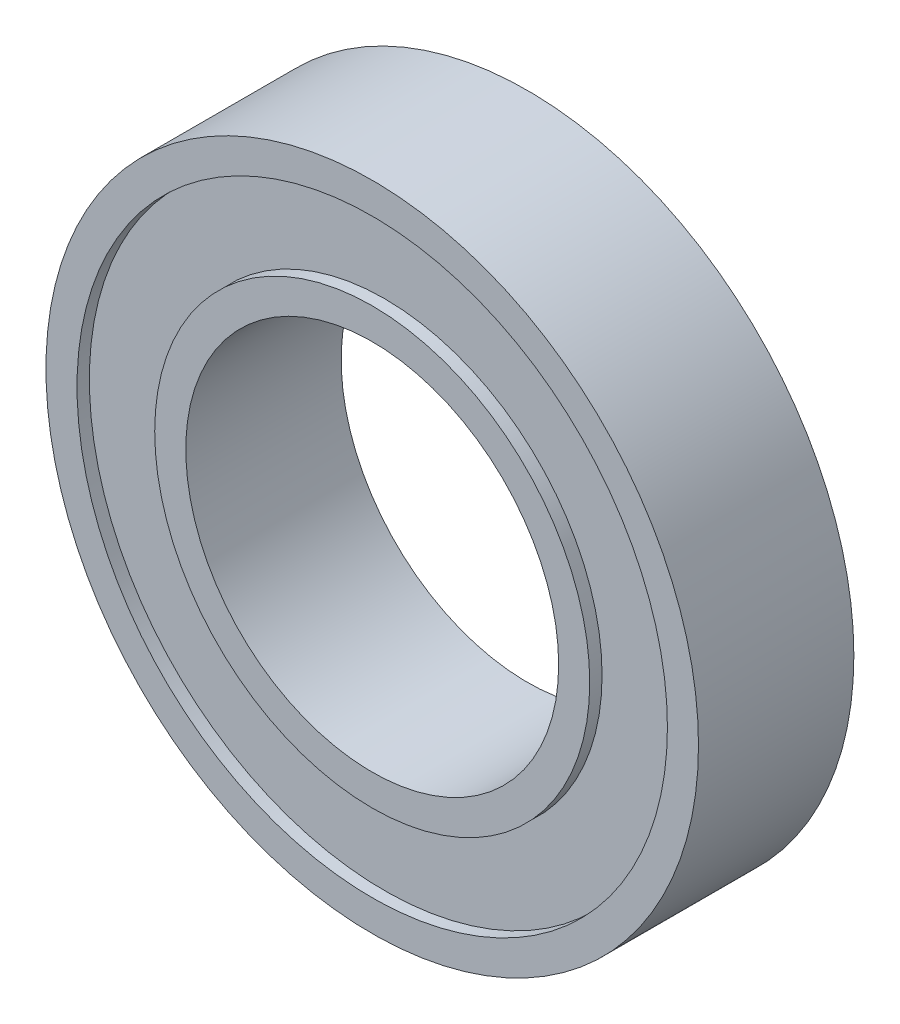
ISO-10303-21;
HEADER;
FILE_DESCRIPTION(('STEP AP214'),'2;1');
FILE_NAME('part.step','',(''),(''),'','','');
FILE_SCHEMA(('AUTOMOTIVE_DESIGN { 1 0 10303 214 1 1 1 1 }'));
ENDSEC;
DATA;
#1=APPLICATION_CONTEXT('core data for automotive mechanical design processes');
#2=APPLICATION_PROTOCOL_DEFINITION('international standard','automotive_design',2000,#1);
#3=PRODUCT_CONTEXT('',#1,'mechanical');
#4=PRODUCT('Part','Part','',(#3));
#5=PRODUCT_RELATED_PRODUCT_CATEGORY('part','',(#4));
#6=PRODUCT_DEFINITION_FORMATION('','',#4);
#7=PRODUCT_DEFINITION_CONTEXT('part definition',#1,'design');
#8=PRODUCT_DEFINITION('design','',#6,#7);
#9=PRODUCT_DEFINITION_SHAPE('','',#8);
#10=(LENGTH_UNIT() NAMED_UNIT(*) SI_UNIT(.MILLI.,.METRE.));
#11=(NAMED_UNIT(*) PLANE_ANGLE_UNIT() SI_UNIT($,.RADIAN.));
#12=(NAMED_UNIT(*) SI_UNIT($,.STERADIAN.) SOLID_ANGLE_UNIT());
#13=UNCERTAINTY_MEASURE_WITH_UNIT(LENGTH_MEASURE(1.E-05),#10,'distance_accuracy_value','');
#14=(GEOMETRIC_REPRESENTATION_CONTEXT(3) GLOBAL_UNCERTAINTY_ASSIGNED_CONTEXT((#13)) GLOBAL_UNIT_ASSIGNED_CONTEXT((#10,
#11,#12)) REPRESENTATION_CONTEXT('',''));
#15=CARTESIAN_POINT('',(0.,0.,0.));
#16=DIRECTION('',(0.,0.,1.));
#17=DIRECTION('',(1.,0.,0.));
#18=AXIS2_PLACEMENT_3D('',#15,#16,#17);
#19=CARTESIAN_POINT('',(0.,0.,-2.5));
#20=DIRECTION('',(0.,0.,1.));
#21=DIRECTION('',(1.,0.,0.));
#22=AXIS2_PLACEMENT_3D('',#19,#20,#21);
#23=CYLINDRICAL_SURFACE('',#22,9.5);
#24=CARTESIAN_POINT('',(0.,0.,-2.5));
#25=DIRECTION('',(0.,0.,1.));
#26=DIRECTION('',(1.,0.,0.));
#27=AXIS2_PLACEMENT_3D('',#24,#25,#26);
#28=CIRCLE('',#27,9.5);
#29=CARTESIAN_POINT('',(9.5,0.,-2.5));
#30=VERTEX_POINT('',#29);
#31=EDGE_CURVE('E60',#30,#30,#28,.T.);
#32=ORIENTED_EDGE('',*,*,#31,.F.);
#33=EDGE_LOOP('',(#32));
#34=FACE_BOUND('',#33,.T.);
#35=CARTESIAN_POINT('',(0.,0.,-2.10312508));
#36=DIRECTION('',(0.,0.,1.));
#37=DIRECTION('',(1.,0.,0.));
#38=AXIS2_PLACEMENT_3D('',#35,#36,#37);
#39=CIRCLE('',#38,9.5);
#40=CARTESIAN_POINT('',(9.5,0.,-2.10312508));
#41=VERTEX_POINT('',#40);
#42=EDGE_CURVE('E11',#41,#41,#39,.F.);
#43=ORIENTED_EDGE('',*,*,#42,.F.);
#44=EDGE_LOOP('',(#43));
#45=FACE_BOUND('',#44,.T.);
#46=ADVANCED_FACE('F49',(#34,#45),#23,.F.);
#47=CARTESIAN_POINT('',(0.,0.,2.10312508));
#48=DIRECTION('',(0.,0.,1.));
#49=DIRECTION('',(1.,0.,0.));
#50=AXIS2_PLACEMENT_3D('',#47,#48,#49);
#51=CIRCLE('',#50,9.5);
#52=CARTESIAN_POINT('',(9.5,0.,2.10312508));
#53=VERTEX_POINT('',#52);
#54=EDGE_CURVE('E72',#53,#53,#51,.T.);
#55=ORIENTED_EDGE('',*,*,#54,.F.);
#56=EDGE_LOOP('',(#55));
#57=FACE_BOUND('',#56,.T.);
#58=CARTESIAN_POINT('',(0.,0.,2.5));
#59=DIRECTION('',(0.,0.,1.));
#60=DIRECTION('',(1.,0.,0.));
#61=AXIS2_PLACEMENT_3D('',#58,#59,#60);
#62=CIRCLE('',#61,9.5);
#63=CARTESIAN_POINT('',(9.5,0.,2.5));
#64=VERTEX_POINT('',#63);
#65=EDGE_CURVE('E69',#64,#64,#62,.T.);
#66=ORIENTED_EDGE('',*,*,#65,.T.);
#67=EDGE_LOOP('',(#66));
#68=FACE_BOUND('',#67,.T.);
#69=ADVANCED_FACE('F51',(#57,#68),#23,.F.);
#70=CARTESIAN_POINT('',(0.,0.,-2.5));
#71=DIRECTION('',(0.,0.,1.));
#72=DIRECTION('',(1.,0.,0.));
#73=AXIS2_PLACEMENT_3D('',#70,#71,#72);
#74=CYLINDRICAL_SURFACE('',#73,10.499999955);
#75=CARTESIAN_POINT('',(0.,0.,-2.5));
#76=DIRECTION('',(0.,0.,1.));
#77=DIRECTION('',(1.,0.,0.));
#78=AXIS2_PLACEMENT_3D('',#75,#76,#77);
#79=CIRCLE('',#78,10.499999955);
#80=CARTESIAN_POINT('',(10.499999955,0.,-2.5));
#81=VERTEX_POINT('',#80);
#82=EDGE_CURVE('E56',#81,#81,#79,.T.);
#83=ORIENTED_EDGE('',*,*,#82,.T.);
#84=EDGE_LOOP('',(#83));
#85=FACE_BOUND('',#84,.T.);
#86=CARTESIAN_POINT('',(0.,0.,2.5));
#87=DIRECTION('',(0.,0.,1.));
#88=DIRECTION('',(1.,0.,0.));
#89=AXIS2_PLACEMENT_3D('',#86,#87,#88);
#90=CIRCLE('',#89,10.499999955);
#91=CARTESIAN_POINT('',(10.499999955,0.,2.5));
#92=VERTEX_POINT('',#91);
#93=EDGE_CURVE('E64',#92,#92,#90,.T.);
#94=ORIENTED_EDGE('',*,*,#93,.F.);
#95=EDGE_LOOP('',(#94));
#96=FACE_BOUND('',#95,.T.);
#97=ADVANCED_FACE('F124',(#85,#96),#74,.T.);
#98=CARTESIAN_POINT('',(0.,0.,-2.5));
#99=DIRECTION('',(0.,0.,1.));
#100=DIRECTION('',(1.,0.,0.));
#101=AXIS2_PLACEMENT_3D('',#98,#99,#100);
#102=PLANE('',#101);
#103=ORIENTED_EDGE('',*,*,#31,.T.);
#104=EDGE_LOOP('',(#103));
#105=FACE_BOUND('',#104,.T.);
#106=ORIENTED_EDGE('',*,*,#82,.F.);
#107=EDGE_LOOP('',(#106));
#108=FACE_BOUND('',#107,.T.);
#109=ADVANCED_FACE('F129',(#105,#108),#102,.F.);
#110=CARTESIAN_POINT('',(0.,0.,2.5));
#111=DIRECTION('',(0.,0.,1.));
#112=DIRECTION('',(1.,0.,0.));
#113=AXIS2_PLACEMENT_3D('',#110,#111,#112);
#114=PLANE('',#113);
#115=ORIENTED_EDGE('',*,*,#65,.F.);
#116=EDGE_LOOP('',(#115));
#117=FACE_BOUND('',#116,.T.);
#118=ORIENTED_EDGE('',*,*,#93,.T.);
#119=EDGE_LOOP('',(#118));
#120=FACE_BOUND('',#119,.T.);
#121=ADVANCED_FACE('F132',(#117,#120),#114,.T.);
#122=CARTESIAN_POINT('',(0.,0.,-2.10312508));
#123=DIRECTION('',(0.,0.,1.));
#124=DIRECTION('',(1.,0.,0.));
#125=AXIS2_PLACEMENT_3D('',#122,#123,#124);
#126=PLANE('',#125);
#127=CARTESIAN_POINT('',(0.,0.,-2.10312508));
#128=DIRECTION('',(0.,0.,1.));
#129=DIRECTION('',(1.,0.,0.));
#130=AXIS2_PLACEMENT_3D('',#127,#128,#129);
#131=CIRCLE('',#130,7.);
#132=CARTESIAN_POINT('',(7.,0.,-2.10312508));
#133=VERTEX_POINT('',#132);
#134=EDGE_CURVE('E78',#133,#133,#131,.T.);
#135=ORIENTED_EDGE('',*,*,#134,.T.);
#136=EDGE_LOOP('',(#135));
#137=FACE_BOUND('',#136,.T.);
#138=ORIENTED_EDGE('',*,*,#42,.T.);
#139=EDGE_LOOP('',(#138));
#140=FACE_BOUND('',#139,.T.);
#141=ADVANCED_FACE('F138',(#137,#140),#126,.F.);
#142=CARTESIAN_POINT('',(0.,0.,2.10312508));
#143=DIRECTION('',(0.,0.,1.));
#144=DIRECTION('',(1.,0.,0.));
#145=AXIS2_PLACEMENT_3D('',#142,#143,#144);
#146=PLANE('',#145);
#147=CARTESIAN_POINT('',(0.,0.,2.10312508));
#148=DIRECTION('',(0.,0.,1.));
#149=DIRECTION('',(1.,0.,0.));
#150=AXIS2_PLACEMENT_3D('',#147,#148,#149);
#151=CIRCLE('',#150,7.);
#152=CARTESIAN_POINT('',(7.,0.,2.10312508));
#153=VERTEX_POINT('',#152);
#154=EDGE_CURVE('E75',#153,#153,#151,.T.);
#155=ORIENTED_EDGE('',*,*,#154,.F.);
#156=EDGE_LOOP('',(#155));
#157=FACE_BOUND('',#156,.T.);
#158=ORIENTED_EDGE('',*,*,#54,.T.);
#159=EDGE_LOOP('',(#158));
#160=FACE_BOUND('',#159,.T.);
#161=ADVANCED_FACE('F117',(#157,#160),#146,.T.);
#162=CARTESIAN_POINT('',(0.,0.,-2.5));
#163=DIRECTION('',(0.,0.,1.));
#164=DIRECTION('',(1.,0.,0.));
#165=AXIS2_PLACEMENT_3D('',#162,#163,#164);
#166=CYLINDRICAL_SURFACE('',#165,7.);
#167=CARTESIAN_POINT('',(0.,0.,-2.5));
#168=DIRECTION('',(0.,0.,1.));
#169=DIRECTION('',(1.,0.,0.));
#170=AXIS2_PLACEMENT_3D('',#167,#168,#169);
#171=CIRCLE('',#170,7.);
#172=CARTESIAN_POINT('',(7.,0.,-2.5));
#173=VERTEX_POINT('',#172);
#174=EDGE_CURVE('E81',#173,#173,#171,.T.);
#175=ORIENTED_EDGE('',*,*,#174,.T.);
#176=EDGE_LOOP('',(#175));
#177=FACE_BOUND('',#176,.T.);
#178=ORIENTED_EDGE('',*,*,#134,.F.);
#179=EDGE_LOOP('',(#178));
#180=FACE_BOUND('',#179,.T.);
#181=ADVANCED_FACE('F107',(#177,#180),#166,.T.);
#182=CARTESIAN_POINT('',(0.,0.,-2.5));
#183=DIRECTION('',(0.,0.,1.));
#184=DIRECTION('',(1.,0.,0.));
#185=AXIS2_PLACEMENT_3D('',#182,#183,#184);
#186=CYLINDRICAL_SURFACE('',#185,5.999999938);
#187=CARTESIAN_POINT('',(0.,0.,-2.5));
#188=DIRECTION('',(0.,0.,1.));
#189=DIRECTION('',(1.,0.,0.));
#190=AXIS2_PLACEMENT_3D('',#187,#188,#189);
#191=CIRCLE('',#190,5.999999938);
#192=CARTESIAN_POINT('',(5.999999938,0.,-2.5));
#193=VERTEX_POINT('',#192);
#194=EDGE_CURVE('E84',#193,#193,#191,.T.);
#195=ORIENTED_EDGE('',*,*,#194,.F.);
#196=EDGE_LOOP('',(#195));
#197=FACE_BOUND('',#196,.T.);
#198=CARTESIAN_POINT('',(0.,0.,2.5));
#199=DIRECTION('',(0.,0.,1.));
#200=DIRECTION('',(1.,0.,0.));
#201=AXIS2_PLACEMENT_3D('',#198,#199,#200);
#202=CIRCLE('',#201,5.999999938);
#203=CARTESIAN_POINT('',(5.999999938,0.,2.5));
#204=VERTEX_POINT('',#203);
#205=EDGE_CURVE('E90',#204,#204,#202,.T.);
#206=ORIENTED_EDGE('',*,*,#205,.T.);
#207=EDGE_LOOP('',(#206));
#208=FACE_BOUND('',#207,.T.);
#209=ADVANCED_FACE('F94',(#197,#208),#186,.F.);
#210=ORIENTED_EDGE('',*,*,#154,.T.);
#211=EDGE_LOOP('',(#210));
#212=FACE_BOUND('',#211,.T.);
#213=CARTESIAN_POINT('',(0.,0.,2.5));
#214=DIRECTION('',(0.,0.,1.));
#215=DIRECTION('',(1.,0.,0.));
#216=AXIS2_PLACEMENT_3D('',#213,#214,#215);
#217=CIRCLE('',#216,7.);
#218=CARTESIAN_POINT('',(7.,0.,2.5));
#219=VERTEX_POINT('',#218);
#220=EDGE_CURVE('E87',#219,#219,#217,.T.);
#221=ORIENTED_EDGE('',*,*,#220,.F.);
#222=EDGE_LOOP('',(#221));
#223=FACE_BOUND('',#222,.T.);
#224=ADVANCED_FACE('F103',(#212,#223),#166,.T.);
#225=CARTESIAN_POINT('',(0.,0.,-2.5));
#226=DIRECTION('',(0.,0.,1.));
#227=DIRECTION('',(1.,0.,0.));
#228=AXIS2_PLACEMENT_3D('',#225,#226,#227);
#229=PLANE('',#228);
#230=ORIENTED_EDGE('',*,*,#194,.T.);
#231=EDGE_LOOP('',(#230));
#232=FACE_BOUND('',#231,.T.);
#233=ORIENTED_EDGE('',*,*,#174,.F.);
#234=EDGE_LOOP('',(#233));
#235=FACE_BOUND('',#234,.T.);
#236=ADVANCED_FACE('F99',(#232,#235),#229,.F.);
#237=CARTESIAN_POINT('',(0.,0.,2.5));
#238=DIRECTION('',(0.,0.,1.));
#239=DIRECTION('',(1.,0.,0.));
#240=AXIS2_PLACEMENT_3D('',#237,#238,#239);
#241=PLANE('',#240);
#242=ORIENTED_EDGE('',*,*,#205,.F.);
#243=EDGE_LOOP('',(#242));
#244=FACE_BOUND('',#243,.T.);
#245=ORIENTED_EDGE('',*,*,#220,.T.);
#246=EDGE_LOOP('',(#245));
#247=FACE_BOUND('',#246,.T.);
#248=ADVANCED_FACE('F96',(#244,#247),#241,.T.);
#249=CLOSED_SHELL('',(#46,#69,#97,#109,#121,#141,#161,#181,#209,#224,#236,#248));
#250=MANIFOLD_SOLID_BREP('B2',#249);
#251=ADVANCED_BREP_SHAPE_REPRESENTATION('',(#18,#250),#14);
#252=SHAPE_DEFINITION_REPRESENTATION(#9,#251);
ENDSEC;
END-ISO-10303-21;
